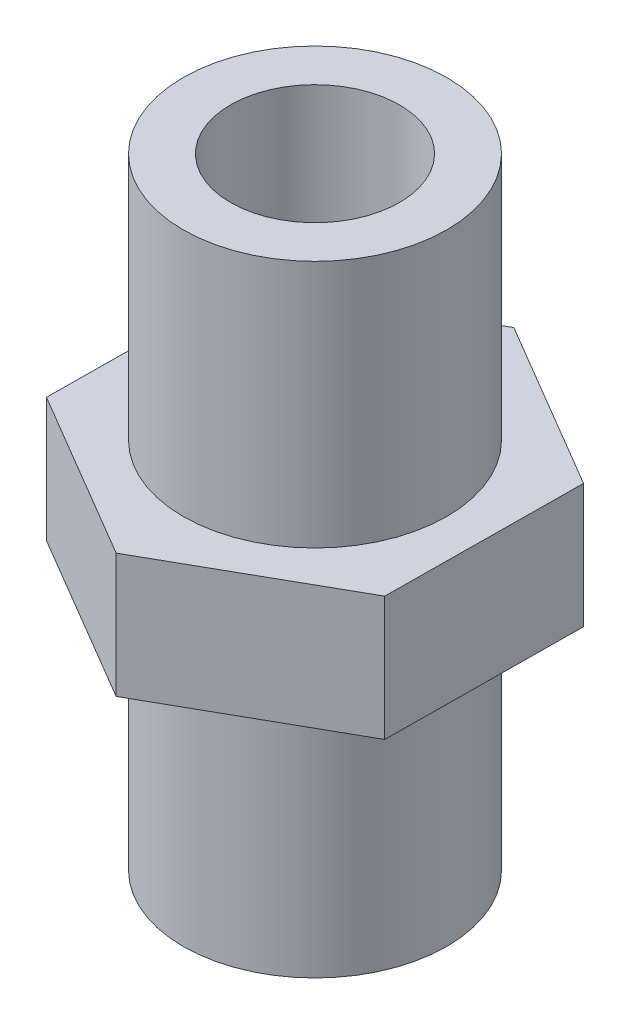
ISO-10303-21;
HEADER;
FILE_DESCRIPTION(('STEP AP214'),'2;1');
FILE_NAME('part.step','',(''),(''),'','','');
FILE_SCHEMA(('AUTOMOTIVE_DESIGN { 1 0 10303 214 1 1 1 1 }'));
ENDSEC;
DATA;
#1=APPLICATION_CONTEXT('core data for automotive mechanical design processes');
#2=APPLICATION_PROTOCOL_DEFINITION('international standard','automotive_design',2000,#1);
#3=PRODUCT_CONTEXT('',#1,'mechanical');
#4=PRODUCT('Part','Part','',(#3));
#5=PRODUCT_RELATED_PRODUCT_CATEGORY('part','',(#4));
#6=PRODUCT_DEFINITION_FORMATION('','',#4);
#7=PRODUCT_DEFINITION_CONTEXT('part definition',#1,'design');
#8=PRODUCT_DEFINITION('design','',#6,#7);
#9=PRODUCT_DEFINITION_SHAPE('','',#8);
#10=(LENGTH_UNIT() NAMED_UNIT(*) SI_UNIT(.MILLI.,.METRE.));
#11=(NAMED_UNIT(*) PLANE_ANGLE_UNIT() SI_UNIT($,.RADIAN.));
#12=(NAMED_UNIT(*) SI_UNIT($,.STERADIAN.) SOLID_ANGLE_UNIT());
#13=UNCERTAINTY_MEASURE_WITH_UNIT(LENGTH_MEASURE(1.E-05),#10,'distance_accuracy_value','');
#14=(GEOMETRIC_REPRESENTATION_CONTEXT(3) GLOBAL_UNCERTAINTY_ASSIGNED_CONTEXT((#13)) GLOBAL_UNIT_ASSIGNED_CONTEXT((#10,
#11,#12)) REPRESENTATION_CONTEXT('',''));
#15=CARTESIAN_POINT('',(0.,0.,0.));
#16=DIRECTION('',(0.,0.,1.));
#17=DIRECTION('',(1.,0.,0.));
#18=AXIS2_PLACEMENT_3D('',#15,#16,#17);
#19=CARTESIAN_POINT('',(0.,20.,0.));
#20=DIRECTION('',(0.,-1.,0.));
#21=DIRECTION('',(0.,0.,-1.));
#22=AXIS2_PLACEMENT_3D('',#19,#20,#21);
#23=CYLINDRICAL_SURFACE('',#22,8.5);
#24=CARTESIAN_POINT('',(0.,4.,0.));
#25=DIRECTION('',(0.,1.,0.));
#26=DIRECTION('',(0.,0.,1.));
#27=AXIS2_PLACEMENT_3D('',#24,#25,#26);
#28=CIRCLE('',#27,8.5);
#29=CARTESIAN_POINT('',(0.,4.,8.5));
#30=VERTEX_POINT('',#29);
#31=EDGE_CURVE('E142',#30,#30,#28,.T.);
#32=ORIENTED_EDGE('',*,*,#31,.T.);
#33=EDGE_LOOP('',(#32));
#34=FACE_BOUND('',#33,.T.);
#35=CARTESIAN_POINT('',(0.,20.,0.));
#36=DIRECTION('',(0.,1.,0.));
#37=DIRECTION('',(0.,0.,1.));
#38=AXIS2_PLACEMENT_3D('',#35,#36,#37);
#39=CIRCLE('',#38,8.5);
#40=CARTESIAN_POINT('',(0.,20.,8.5));
#41=VERTEX_POINT('',#40);
#42=EDGE_CURVE('E143',#41,#41,#39,.T.);
#43=ORIENTED_EDGE('',*,*,#42,.F.);
#44=EDGE_LOOP('',(#43));
#45=FACE_BOUND('',#44,.T.);
#46=ADVANCED_FACE('F36',(#34,#45),#23,.T.);
#47=CARTESIAN_POINT('',(0.,20.,0.));
#48=DIRECTION('',(0.,1.,0.));
#49=DIRECTION('',(0.,0.,1.));
#50=AXIS2_PLACEMENT_3D('',#47,#48,#49);
#51=PLANE('',#50);
#52=CARTESIAN_POINT('',(0.,20.,0.));
#53=DIRECTION('',(0.,1.,0.));
#54=DIRECTION('',(0.,0.,1.));
#55=AXIS2_PLACEMENT_3D('',#52,#53,#54);
#56=CIRCLE('',#55,5.45);
#57=CARTESIAN_POINT('',(0.,20.,5.45));
#58=VERTEX_POINT('',#57);
#59=EDGE_CURVE('E126',#58,#58,#56,.T.);
#60=ORIENTED_EDGE('',*,*,#59,.F.);
#61=EDGE_LOOP('',(#60));
#62=FACE_BOUND('',#61,.T.);
#63=ORIENTED_EDGE('',*,*,#42,.T.);
#64=EDGE_LOOP('',(#63));
#65=FACE_BOUND('',#64,.T.);
#66=ADVANCED_FACE('F169',(#62,#65),#51,.T.);
#67=CARTESIAN_POINT('',(10.9426303635316,4.,6.44919948989408));
#68=DIRECTION('',(-0.99995982443724,0.,-0.00896378889999207));
#69=DIRECTION('',(-0.00896378889999207,0.,0.99995982443724));
#70=AXIS2_PLACEMENT_3D('',#67,#68,#69);
#71=PLANE('',#70);
#72=DIRECTION('',(0.00896378889999207,0.,-0.99995982443724));
#73=VECTOR('',#72,1.);
#74=CARTESIAN_POINT('',(10.9426303635316,-4.,6.44919948989408));
#75=LINE('',#74,#73);
#76=CARTESIAN_POINT('',(10.9426303635316,-4.,6.44919948989408));
#77=VERTEX_POINT('',#76);
#78=CARTESIAN_POINT('',(11.0564857740877,-4.,-6.25199613409425));
#79=VERTEX_POINT('',#78);
#80=EDGE_CURVE('E122',#77,#79,#75,.T.);
#81=ORIENTED_EDGE('',*,*,#80,.T.);
#82=DIRECTION('',(0.,-1.,0.));
#83=VECTOR('',#82,1.);
#84=CARTESIAN_POINT('',(11.0564857740877,4.,-6.25199613409425));
#85=LINE('',#84,#83);
#86=CARTESIAN_POINT('',(11.0564857740877,4.,-6.25199613409425));
#87=VERTEX_POINT('',#86);
#88=EDGE_CURVE('E140',#87,#79,#85,.T.);
#89=ORIENTED_EDGE('',*,*,#88,.F.);
#90=DIRECTION('',(0.00896378889999207,0.,-0.99995982443724));
#91=VECTOR('',#90,1.);
#92=CARTESIAN_POINT('',(10.9426303635316,4.,6.44919948989408));
#93=LINE('',#92,#91);
#94=CARTESIAN_POINT('',(10.9426303635316,4.,6.44919948989408));
#95=VERTEX_POINT('',#94);
#96=EDGE_CURVE('E133',#95,#87,#93,.T.);
#97=ORIENTED_EDGE('',*,*,#96,.F.);
#98=DIRECTION('',(0.,-1.,0.));
#99=VECTOR('',#98,1.);
#100=CARTESIAN_POINT('',(10.9426303635316,4.,6.44919948989408));
#101=LINE('',#100,#99);
#102=EDGE_CURVE('E118',#95,#77,#101,.T.);
#103=ORIENTED_EDGE('',*,*,#102,.T.);
#104=EDGE_LOOP('',(#81,#89,#97,#103));
#105=FACE_BOUND('',#104,.T.);
#106=ADVANCED_FACE('F173',(#105),#71,.F.);
#107=CARTESIAN_POINT('',(11.0564857740877,4.,-6.25199613409425));
#108=DIRECTION('',(-0.507742781120175,0.,0.861508716276481));
#109=DIRECTION('',(0.861508716276481,0.,0.507742781120175));
#110=AXIS2_PLACEMENT_3D('',#107,#108,#109);
#111=PLANE('',#110);
#112=DIRECTION('',(-0.861508716276481,0.,-0.507742781120175));
#113=VECTOR('',#112,1.);
#114=CARTESIAN_POINT('',(11.0564857740877,-4.,-6.25199613409425));
#115=LINE('',#114,#113);
#116=CARTESIAN_POINT('',(0.11385541055613,-4.,-12.7011956239883));
#117=VERTEX_POINT('',#116);
#118=EDGE_CURVE('E125',#79,#117,#115,.T.);
#119=ORIENTED_EDGE('',*,*,#118,.T.);
#120=DIRECTION('',(0.,-1.,0.));
#121=VECTOR('',#120,1.);
#122=CARTESIAN_POINT('',(0.11385541055613,4.,-12.7011956239883));
#123=LINE('',#122,#121);
#124=CARTESIAN_POINT('',(0.11385541055613,4.,-12.7011956239883));
#125=VERTEX_POINT('',#124);
#126=EDGE_CURVE('E137',#125,#117,#123,.T.);
#127=ORIENTED_EDGE('',*,*,#126,.F.);
#128=DIRECTION('',(-0.861508716276481,0.,-0.507742781120175));
#129=VECTOR('',#128,1.);
#130=CARTESIAN_POINT('',(11.0564857740877,4.,-6.25199613409425));
#131=LINE('',#130,#129);
#132=EDGE_CURVE('E91',#87,#125,#131,.T.);
#133=ORIENTED_EDGE('',*,*,#132,.F.);
#134=ORIENTED_EDGE('',*,*,#88,.T.);
#135=EDGE_LOOP('',(#119,#127,#133,#134));
#136=FACE_BOUND('',#135,.T.);
#137=ADVANCED_FACE('F200',(#136),#111,.F.);
#138=CARTESIAN_POINT('',(0.11385541055613,4.,-12.7011956239883));
#139=DIRECTION('',(0.492217043317066,0.,0.870472505176474));
#140=DIRECTION('',(0.870472505176474,0.,-0.492217043317066));
#141=AXIS2_PLACEMENT_3D('',#138,#139,#140);
#142=PLANE('',#141);
#143=DIRECTION('',(-0.870472505176474,0.,0.492217043317066));
#144=VECTOR('',#143,1.);
#145=CARTESIAN_POINT('',(0.11385541055613,-4.,-12.7011956239883));
#146=LINE('',#145,#144);
#147=CARTESIAN_POINT('',(-10.9426303635316,-4.,-6.44919948989409));
#148=VERTEX_POINT('',#147);
#149=EDGE_CURVE('E128',#117,#148,#146,.T.);
#150=ORIENTED_EDGE('',*,*,#149,.T.);
#151=DIRECTION('',(0.,-1.,0.));
#152=VECTOR('',#151,1.);
#153=CARTESIAN_POINT('',(-10.9426303635316,4.,-6.44919948989409));
#154=LINE('',#153,#152);
#155=CARTESIAN_POINT('',(-10.9426303635316,4.,-6.44919948989409));
#156=VERTEX_POINT('',#155);
#157=EDGE_CURVE('E113',#156,#148,#154,.T.);
#158=ORIENTED_EDGE('',*,*,#157,.F.);
#159=DIRECTION('',(-0.870472505176474,0.,0.492217043317066));
#160=VECTOR('',#159,1.);
#161=CARTESIAN_POINT('',(0.11385541055613,4.,-12.7011956239883));
#162=LINE('',#161,#160);
#163=EDGE_CURVE('E104',#125,#156,#162,.T.);
#164=ORIENTED_EDGE('',*,*,#163,.F.);
#165=ORIENTED_EDGE('',*,*,#126,.T.);
#166=EDGE_LOOP('',(#150,#158,#164,#165));
#167=FACE_BOUND('',#166,.T.);
#168=ADVANCED_FACE('F202',(#167),#142,.F.);
#169=CARTESIAN_POINT('',(-10.9426303635316,4.,-6.44919948989409));
#170=DIRECTION('',(0.99995982443724,0.,0.00896378889999221));
#171=DIRECTION('',(0.00896378889999221,0.,-0.99995982443724));
#172=AXIS2_PLACEMENT_3D('',#169,#170,#171);
#173=PLANE('',#172);
#174=DIRECTION('',(-0.0089637888999922,0.,0.99995982443724));
#175=VECTOR('',#174,1.);
#176=CARTESIAN_POINT('',(-10.9426303635316,-4.,-6.44919948989409));
#177=LINE('',#176,#175);
#178=CARTESIAN_POINT('',(-11.0564857740877,-4.,6.25199613409425));
#179=VERTEX_POINT('',#178);
#180=EDGE_CURVE('E112',#148,#179,#177,.T.);
#181=ORIENTED_EDGE('',*,*,#180,.T.);
#182=DIRECTION('',(0.,-1.,0.));
#183=VECTOR('',#182,1.);
#184=CARTESIAN_POINT('',(-11.0564857740877,4.,6.25199613409425));
#185=LINE('',#184,#183);
#186=CARTESIAN_POINT('',(-11.0564857740877,4.,6.25199613409425));
#187=VERTEX_POINT('',#186);
#188=EDGE_CURVE('E109',#187,#179,#185,.T.);
#189=ORIENTED_EDGE('',*,*,#188,.F.);
#190=DIRECTION('',(-0.0089637888999922,0.,0.99995982443724));
#191=VECTOR('',#190,1.);
#192=CARTESIAN_POINT('',(-10.9426303635316,4.,-6.44919948989409));
#193=LINE('',#192,#191);
#194=EDGE_CURVE('E98',#156,#187,#193,.T.);
#195=ORIENTED_EDGE('',*,*,#194,.F.);
#196=ORIENTED_EDGE('',*,*,#157,.T.);
#197=EDGE_LOOP('',(#181,#189,#195,#196));
#198=FACE_BOUND('',#197,.T.);
#199=ADVANCED_FACE('F110',(#198),#173,.F.);
#200=CARTESIAN_POINT('',(-11.0564857740877,4.,6.25199613409425));
#201=DIRECTION('',(0.507742781120175,0.,-0.861508716276481));
#202=DIRECTION('',(-0.861508716276481,0.,-0.507742781120175));
#203=AXIS2_PLACEMENT_3D('',#200,#201,#202);
#204=PLANE('',#203);
#205=DIRECTION('',(0.861508716276481,0.,0.507742781120175));
#206=VECTOR('',#205,1.);
#207=CARTESIAN_POINT('',(-11.0564857740877,-4.,6.25199613409425));
#208=LINE('',#207,#206);
#209=CARTESIAN_POINT('',(-0.113855410556133,-4.,12.7011956239883));
#210=VERTEX_POINT('',#209);
#211=EDGE_CURVE('E76',#179,#210,#208,.T.);
#212=ORIENTED_EDGE('',*,*,#211,.T.);
#213=DIRECTION('',(0.,-1.,0.));
#214=VECTOR('',#213,1.);
#215=CARTESIAN_POINT('',(-0.113855410556133,4.,12.7011956239883));
#216=LINE('',#215,#214);
#217=CARTESIAN_POINT('',(-0.113855410556133,4.,12.7011956239883));
#218=VERTEX_POINT('',#217);
#219=EDGE_CURVE('E114',#218,#210,#216,.T.);
#220=ORIENTED_EDGE('',*,*,#219,.F.);
#221=DIRECTION('',(0.861508716276481,0.,0.507742781120175));
#222=VECTOR('',#221,1.);
#223=CARTESIAN_POINT('',(-11.0564857740877,4.,6.25199613409425));
#224=LINE('',#223,#222);
#225=EDGE_CURVE('E102',#187,#218,#224,.T.);
#226=ORIENTED_EDGE('',*,*,#225,.F.);
#227=ORIENTED_EDGE('',*,*,#188,.T.);
#228=EDGE_LOOP('',(#212,#220,#226,#227));
#229=FACE_BOUND('',#228,.T.);
#230=ADVANCED_FACE('F116',(#229),#204,.F.);
#231=CARTESIAN_POINT('',(-0.113855410556133,4.,12.7011956239883));
#232=DIRECTION('',(-0.492217043317066,0.,-0.870472505176474));
#233=DIRECTION('',(-0.870472505176474,0.,0.492217043317066));
#234=AXIS2_PLACEMENT_3D('',#231,#232,#233);
#235=PLANE('',#234);
#236=DIRECTION('',(0.870472505176474,0.,-0.492217043317066));
#237=VECTOR('',#236,1.);
#238=CARTESIAN_POINT('',(-0.113855410556133,-4.,12.7011956239883));
#239=LINE('',#238,#237);
#240=EDGE_CURVE('E82',#210,#77,#239,.T.);
#241=ORIENTED_EDGE('',*,*,#240,.T.);
#242=ORIENTED_EDGE('',*,*,#102,.F.);
#243=DIRECTION('',(0.870472505176474,0.,-0.492217043317066));
#244=VECTOR('',#243,1.);
#245=CARTESIAN_POINT('',(-0.113855410556133,4.,12.7011956239883));
#246=LINE('',#245,#244);
#247=EDGE_CURVE('E53',#218,#95,#246,.T.);
#248=ORIENTED_EDGE('',*,*,#247,.F.);
#249=ORIENTED_EDGE('',*,*,#219,.T.);
#250=EDGE_LOOP('',(#241,#242,#248,#249));
#251=FACE_BOUND('',#250,.T.);
#252=ADVANCED_FACE('F157',(#251),#235,.F.);
#253=CARTESIAN_POINT('',(0.,4.,0.));
#254=DIRECTION('',(0.,1.,0.));
#255=DIRECTION('',(0.,0.,1.));
#256=AXIS2_PLACEMENT_3D('',#253,#254,#255);
#257=PLANE('',#256);
#258=ORIENTED_EDGE('',*,*,#31,.F.);
#259=EDGE_LOOP('',(#258));
#260=FACE_BOUND('',#259,.T.);
#261=ORIENTED_EDGE('',*,*,#96,.T.);
#262=ORIENTED_EDGE('',*,*,#132,.T.);
#263=ORIENTED_EDGE('',*,*,#163,.T.);
#264=ORIENTED_EDGE('',*,*,#194,.T.);
#265=ORIENTED_EDGE('',*,*,#225,.T.);
#266=ORIENTED_EDGE('',*,*,#247,.T.);
#267=EDGE_LOOP('',(#261,#262,#263,#264,#265,#266));
#268=FACE_BOUND('',#267,.T.);
#269=ADVANCED_FACE('F100',(#260,#268),#257,.T.);
#270=CARTESIAN_POINT('',(0.,-4.,0.));
#271=DIRECTION('',(0.,1.,0.));
#272=DIRECTION('',(0.,0.,1.));
#273=AXIS2_PLACEMENT_3D('',#270,#271,#272);
#274=PLANE('',#273);
#275=CARTESIAN_POINT('',(0.,-4.,0.));
#276=DIRECTION('',(0.,1.,0.));
#277=DIRECTION('',(0.,0.,1.));
#278=AXIS2_PLACEMENT_3D('',#275,#276,#277);
#279=CIRCLE('',#278,8.5);
#280=CARTESIAN_POINT('',(0.,-4.,8.5));
#281=VERTEX_POINT('',#280);
#282=EDGE_CURVE('E45',#281,#281,#279,.T.);
#283=ORIENTED_EDGE('',*,*,#282,.T.);
#284=EDGE_LOOP('',(#283));
#285=FACE_BOUND('',#284,.T.);
#286=ORIENTED_EDGE('',*,*,#80,.F.);
#287=ORIENTED_EDGE('',*,*,#240,.F.);
#288=ORIENTED_EDGE('',*,*,#211,.F.);
#289=ORIENTED_EDGE('',*,*,#180,.F.);
#290=ORIENTED_EDGE('',*,*,#149,.F.);
#291=ORIENTED_EDGE('',*,*,#118,.F.);
#292=EDGE_LOOP('',(#286,#287,#288,#289,#290,#291));
#293=FACE_BOUND('',#292,.T.);
#294=ADVANCED_FACE('F156',(#285,#293),#274,.F.);
#295=CARTESIAN_POINT('',(0.,-20.,0.));
#296=DIRECTION('',(0.,1.,0.));
#297=DIRECTION('',(0.,0.,1.));
#298=AXIS2_PLACEMENT_3D('',#295,#296,#297);
#299=CIRCLE('',#298,8.5);
#300=CARTESIAN_POINT('',(0.,-20.,8.5));
#301=VERTEX_POINT('',#300);
#302=EDGE_CURVE('E146',#301,#301,#299,.T.);
#303=ORIENTED_EDGE('',*,*,#302,.T.);
#304=EDGE_LOOP('',(#303));
#305=FACE_BOUND('',#304,.T.);
#306=ORIENTED_EDGE('',*,*,#282,.F.);
#307=EDGE_LOOP('',(#306));
#308=FACE_BOUND('',#307,.T.);
#309=ADVANCED_FACE('F163',(#305,#308),#23,.T.);
#310=CARTESIAN_POINT('',(0.,-20.,0.));
#311=DIRECTION('',(0.,1.,0.));
#312=DIRECTION('',(0.,0.,1.));
#313=AXIS2_PLACEMENT_3D('',#310,#311,#312);
#314=CYLINDRICAL_SURFACE('',#313,5.45);
#315=CARTESIAN_POINT('',(0.,-14.7752990516203,0.));
#316=DIRECTION('',(0.,-1.,0.));
#317=DIRECTION('',(0.,0.,-1.));
#318=AXIS2_PLACEMENT_3D('',#315,#316,#317);
#319=CIRCLE('',#318,5.45);
#320=CARTESIAN_POINT('',(0.,-14.7752990516203,-5.45));
#321=VERTEX_POINT('',#320);
#322=EDGE_CURVE('E11',#321,#321,#319,.T.);
#323=ORIENTED_EDGE('',*,*,#322,.T.);
#324=EDGE_LOOP('',(#323));
#325=FACE_BOUND('',#324,.T.);
#326=ORIENTED_EDGE('',*,*,#59,.T.);
#327=EDGE_LOOP('',(#326));
#328=FACE_BOUND('',#327,.T.);
#329=ADVANCED_FACE('F177',(#325,#328),#314,.F.);
#330=CARTESIAN_POINT('',(0.,-14.7752990516203,0.));
#331=DIRECTION('',(0.,-1.,0.));
#332=DIRECTION('',(0.,0.,-1.));
#333=AXIS2_PLACEMENT_3D('',#330,#331,#332);
#334=TOROIDAL_SURFACE('',#333,11.45,6.);
#335=ORIENTED_EDGE('',*,*,#322,.F.);
#336=EDGE_LOOP('',(#335));
#337=FACE_BOUND('',#336,.T.);
#338=ORIENTED_EDGE('',*,*,#302,.F.);
#339=EDGE_LOOP('',(#338));
#340=FACE_BOUND('',#339,.T.);
#341=ADVANCED_FACE('F38',(#337,#340),#334,.T.);
#342=CLOSED_SHELL('',(#46,#66,#106,#137,#168,#199,#230,#252,#269,#294,#309,#329,#341));
#343=MANIFOLD_SOLID_BREP('B2',#342);
#344=ADVANCED_BREP_SHAPE_REPRESENTATION('',(#18,#343),#14);
#345=SHAPE_DEFINITION_REPRESENTATION(#9,#344);
ENDSEC;
END-ISO-10303-21;
